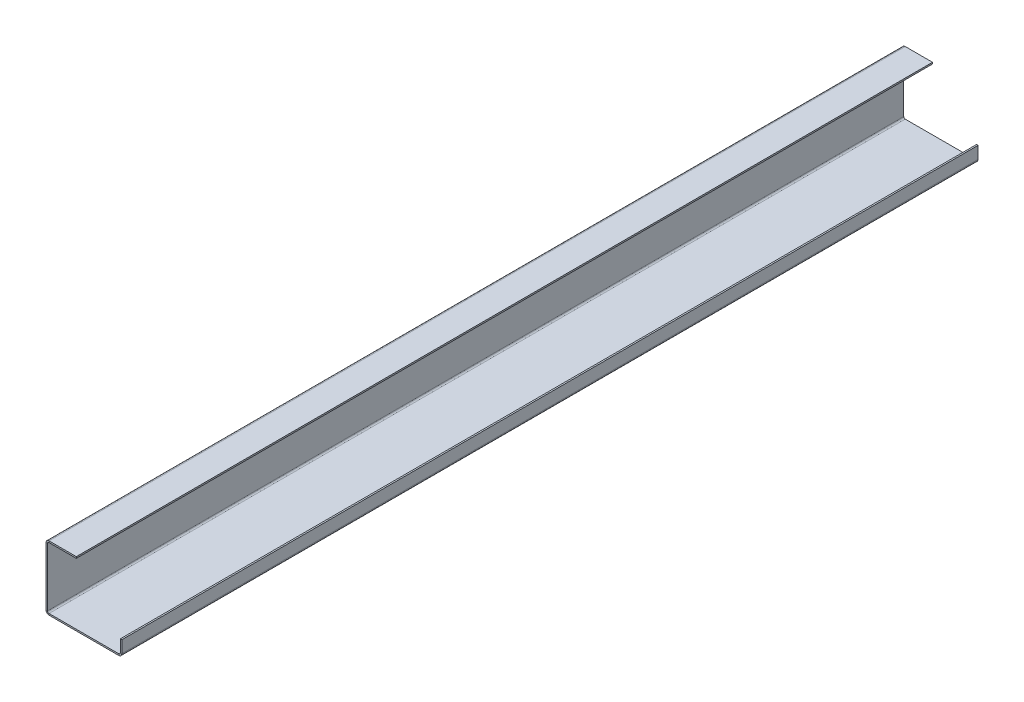
ISO-10303-21;
HEADER;
FILE_DESCRIPTION(('STEP AP214'),'2;1');
FILE_NAME('part.step','',(''),(''),'','','');
FILE_SCHEMA(('AUTOMOTIVE_DESIGN { 1 0 10303 214 1 1 1 1 }'));
ENDSEC;
DATA;
#1=APPLICATION_CONTEXT('core data for automotive mechanical design processes');
#2=APPLICATION_PROTOCOL_DEFINITION('international standard','automotive_design',2000,#1);
#3=PRODUCT_CONTEXT('',#1,'mechanical');
#4=PRODUCT('Part','Part','',(#3));
#5=PRODUCT_RELATED_PRODUCT_CATEGORY('part','',(#4));
#6=PRODUCT_DEFINITION_FORMATION('','',#4);
#7=PRODUCT_DEFINITION_CONTEXT('part definition',#1,'design');
#8=PRODUCT_DEFINITION('design','',#6,#7);
#9=PRODUCT_DEFINITION_SHAPE('','',#8);
#10=(LENGTH_UNIT() NAMED_UNIT(*) SI_UNIT(.MILLI.,.METRE.));
#11=(NAMED_UNIT(*) PLANE_ANGLE_UNIT() SI_UNIT($,.RADIAN.));
#12=(NAMED_UNIT(*) SI_UNIT($,.STERADIAN.) SOLID_ANGLE_UNIT());
#13=UNCERTAINTY_MEASURE_WITH_UNIT(LENGTH_MEASURE(1.E-05),#10,'distance_accuracy_value','');
#14=(GEOMETRIC_REPRESENTATION_CONTEXT(3) GLOBAL_UNCERTAINTY_ASSIGNED_CONTEXT((#13)) GLOBAL_UNIT_ASSIGNED_CONTEXT((#10,
#11,#12)) REPRESENTATION_CONTEXT('',''));
#15=CARTESIAN_POINT('',(0.,0.,0.));
#16=DIRECTION('',(0.,0.,1.));
#17=DIRECTION('',(1.,0.,0.));
#18=AXIS2_PLACEMENT_3D('',#15,#16,#17);
#19=CARTESIAN_POINT('',(4.,85.,1130.));
#20=DIRECTION('',(0.,0.,1.));
#21=DIRECTION('',(1.,0.,0.));
#22=AXIS2_PLACEMENT_3D('',#19,#20,#21);
#23=PLANE('',#22);
#24=DIRECTION('',(0.,-1.,0.));
#25=VECTOR('',#24,1.);
#26=CARTESIAN_POINT('',(4.,85.,1130.));
#27=LINE('',#26,#25);
#28=CARTESIAN_POINT('',(4.,85.,1130.));
#29=VERTEX_POINT('',#28);
#30=CARTESIAN_POINT('',(4.,83.,1130.));
#31=VERTEX_POINT('',#30);
#32=EDGE_CURVE('E11',#29,#31,#27,.T.);
#33=ORIENTED_EDGE('',*,*,#32,.F.);
#34=CARTESIAN_POINT('',(3.99999999999999,81.,1130.));
#35=DIRECTION('',(0.,0.,-1.));
#36=DIRECTION('',(-1.,0.,0.));
#37=AXIS2_PLACEMENT_3D('',#34,#35,#36);
#38=CIRCLE('',#37,4.);
#39=CARTESIAN_POINT('',(0.,81.,1130.));
#40=VERTEX_POINT('',#39);
#41=EDGE_CURVE('E303',#29,#40,#38,.F.);
#42=ORIENTED_EDGE('',*,*,#41,.T.);
#43=DIRECTION('',(-1.,0.,0.));
#44=VECTOR('',#43,1.);
#45=CARTESIAN_POINT('',(1.99999999999999,81.,1130.));
#46=LINE('',#45,#44);
#47=CARTESIAN_POINT('',(1.99999999999999,81.,1130.));
#48=VERTEX_POINT('',#47);
#49=EDGE_CURVE('E44',#48,#40,#46,.T.);
#50=ORIENTED_EDGE('',*,*,#49,.F.);
#51=CARTESIAN_POINT('',(3.99999999999999,81.,1130.));
#52=DIRECTION('',(0.,0.,1.));
#53=DIRECTION('',(1.,0.,0.));
#54=AXIS2_PLACEMENT_3D('',#51,#52,#53);
#55=CIRCLE('',#54,2.);
#56=EDGE_CURVE('E322',#31,#48,#55,.T.);
#57=ORIENTED_EDGE('',*,*,#56,.F.);
#58=EDGE_LOOP('',(#33,#42,#50,#57));
#59=FACE_BOUND('',#58,.T.);
#60=ADVANCED_FACE('F36',(#59),#23,.T.);
#61=CARTESIAN_POINT('',(1.99999999999999,81.,1130.));
#62=DIRECTION('',(0.,0.,1.));
#63=DIRECTION('',(1.,0.,0.));
#64=AXIS2_PLACEMENT_3D('',#61,#62,#63);
#65=PLANE('',#64);
#66=DIRECTION('',(-1.,0.,0.));
#67=VECTOR('',#66,1.);
#68=CARTESIAN_POINT('',(40.,85.,1130.));
#69=LINE('',#68,#67);
#70=CARTESIAN_POINT('',(40.,85.,1130.));
#71=VERTEX_POINT('',#70);
#72=EDGE_CURVE('E307',#71,#29,#69,.T.);
#73=ORIENTED_EDGE('',*,*,#72,.T.);
#74=ORIENTED_EDGE('',*,*,#32,.T.);
#75=DIRECTION('',(-1.,0.,0.));
#76=VECTOR('',#75,1.);
#77=CARTESIAN_POINT('',(40.,83.,1130.));
#78=LINE('',#77,#76);
#79=CARTESIAN_POINT('',(40.,83.,1130.));
#80=VERTEX_POINT('',#79);
#81=EDGE_CURVE('E319',#80,#31,#78,.T.);
#82=ORIENTED_EDGE('',*,*,#81,.F.);
#83=DIRECTION('',(0.,-1.,0.));
#84=VECTOR('',#83,1.);
#85=CARTESIAN_POINT('',(40.,85.,1130.));
#86=LINE('',#85,#84);
#87=EDGE_CURVE('E316',#71,#80,#86,.T.);
#88=ORIENTED_EDGE('',*,*,#87,.F.);
#89=EDGE_LOOP('',(#73,#74,#82,#88));
#90=FACE_BOUND('',#89,.T.);
#91=ADVANCED_FACE('F372',(#90),#65,.T.);
#92=CARTESIAN_POINT('',(0.,81.,0.));
#93=DIRECTION('',(0.,0.,-1.));
#94=DIRECTION('',(-1.,0.,0.));
#95=AXIS2_PLACEMENT_3D('',#92,#93,#94);
#96=PLANE('',#95);
#97=DIRECTION('',(1.,0.,0.));
#98=VECTOR('',#97,1.);
#99=CARTESIAN_POINT('',(0.,81.,0.));
#100=LINE('',#99,#98);
#101=CARTESIAN_POINT('',(0.,81.,0.));
#102=VERTEX_POINT('',#101);
#103=CARTESIAN_POINT('',(1.99999999999999,81.,0.));
#104=VERTEX_POINT('',#103);
#105=EDGE_CURVE('E289',#102,#104,#100,.T.);
#106=ORIENTED_EDGE('',*,*,#105,.F.);
#107=CARTESIAN_POINT('',(3.99999999999999,81.,0.));
#108=DIRECTION('',(0.,0.,-1.));
#109=DIRECTION('',(-1.,0.,0.));
#110=AXIS2_PLACEMENT_3D('',#107,#108,#109);
#111=CIRCLE('',#110,4.);
#112=CARTESIAN_POINT('',(4.,85.,0.));
#113=VERTEX_POINT('',#112);
#114=EDGE_CURVE('E231',#113,#102,#111,.F.);
#115=ORIENTED_EDGE('',*,*,#114,.F.);
#116=DIRECTION('',(0.,1.,0.));
#117=VECTOR('',#116,1.);
#118=CARTESIAN_POINT('',(4.,83.,0.));
#119=LINE('',#118,#117);
#120=CARTESIAN_POINT('',(4.,83.,0.));
#121=VERTEX_POINT('',#120);
#122=EDGE_CURVE('E287',#121,#113,#119,.T.);
#123=ORIENTED_EDGE('',*,*,#122,.F.);
#124=CARTESIAN_POINT('',(3.99999999999999,81.,0.));
#125=DIRECTION('',(0.,0.,1.));
#126=DIRECTION('',(1.,0.,0.));
#127=AXIS2_PLACEMENT_3D('',#124,#125,#126);
#128=CIRCLE('',#127,2.);
#129=EDGE_CURVE('E219',#121,#104,#128,.T.);
#130=ORIENTED_EDGE('',*,*,#129,.T.);
#131=EDGE_LOOP('',(#106,#115,#123,#130));
#132=FACE_BOUND('',#131,.T.);
#133=ADVANCED_FACE('F382',(#132),#96,.T.);
#134=CARTESIAN_POINT('',(4.,83.,0.));
#135=DIRECTION('',(0.,0.,-1.));
#136=DIRECTION('',(-1.,0.,0.));
#137=AXIS2_PLACEMENT_3D('',#134,#135,#136);
#138=PLANE('',#137);
#139=DIRECTION('',(0.,-1.,0.));
#140=VECTOR('',#139,1.);
#141=CARTESIAN_POINT('',(0.,85.,0.));
#142=LINE('',#141,#140);
#143=CARTESIAN_POINT('',(0.,4.,0.));
#144=VERTEX_POINT('',#143);
#145=EDGE_CURVE('E234',#102,#144,#142,.T.);
#146=ORIENTED_EDGE('',*,*,#145,.F.);
#147=ORIENTED_EDGE('',*,*,#105,.T.);
#148=DIRECTION('',(0.,-1.,0.));
#149=VECTOR('',#148,1.);
#150=CARTESIAN_POINT('',(1.99999999999999,85.,0.));
#151=LINE('',#150,#149);
#152=CARTESIAN_POINT('',(2.,4.,0.));
#153=VERTEX_POINT('',#152);
#154=EDGE_CURVE('E216',#104,#153,#151,.T.);
#155=ORIENTED_EDGE('',*,*,#154,.T.);
#156=DIRECTION('',(-1.,0.,0.));
#157=VECTOR('',#156,1.);
#158=CARTESIAN_POINT('',(2.,4.,0.));
#159=LINE('',#158,#157);
#160=EDGE_CURVE('E283',#153,#144,#159,.T.);
#161=ORIENTED_EDGE('',*,*,#160,.T.);
#162=EDGE_LOOP('',(#146,#147,#155,#161));
#163=FACE_BOUND('',#162,.T.);
#164=ADVANCED_FACE('F384',(#163),#138,.T.);
#165=CARTESIAN_POINT('',(0.,4.,1130.));
#166=DIRECTION('',(0.,0.,1.));
#167=DIRECTION('',(1.,0.,0.));
#168=AXIS2_PLACEMENT_3D('',#165,#166,#167);
#169=PLANE('',#168);
#170=DIRECTION('',(1.,0.,0.));
#171=VECTOR('',#170,1.);
#172=CARTESIAN_POINT('',(0.,4.,1130.));
#173=LINE('',#172,#171);
#174=CARTESIAN_POINT('',(0.,4.,1130.));
#175=VERTEX_POINT('',#174);
#176=CARTESIAN_POINT('',(2.,4.,1130.));
#177=VERTEX_POINT('',#176);
#178=EDGE_CURVE('E169',#175,#177,#173,.T.);
#179=ORIENTED_EDGE('',*,*,#178,.F.);
#180=CARTESIAN_POINT('',(4.,4.,1130.));
#181=DIRECTION('',(0.,0.,-1.));
#182=DIRECTION('',(-1.,0.,0.));
#183=AXIS2_PLACEMENT_3D('',#180,#181,#182);
#184=CIRCLE('',#183,4.);
#185=CARTESIAN_POINT('',(4.,0.,1130.));
#186=VERTEX_POINT('',#185);
#187=EDGE_CURVE('E173',#175,#186,#184,.F.);
#188=ORIENTED_EDGE('',*,*,#187,.T.);
#189=DIRECTION('',(0.,-1.,0.));
#190=VECTOR('',#189,1.);
#191=CARTESIAN_POINT('',(4.,2.,1130.));
#192=LINE('',#191,#190);
#193=CARTESIAN_POINT('',(4.,2.,1130.));
#194=VERTEX_POINT('',#193);
#195=EDGE_CURVE('E157',#194,#186,#192,.T.);
#196=ORIENTED_EDGE('',*,*,#195,.F.);
#197=CARTESIAN_POINT('',(4.,4.,1130.));
#198=DIRECTION('',(0.,0.,1.));
#199=DIRECTION('',(1.,0.,0.));
#200=AXIS2_PLACEMENT_3D('',#197,#198,#199);
#201=CIRCLE('',#200,2.);
#202=EDGE_CURVE('E325',#177,#194,#201,.T.);
#203=ORIENTED_EDGE('',*,*,#202,.F.);
#204=EDGE_LOOP('',(#179,#188,#196,#203));
#205=FACE_BOUND('',#204,.T.);
#206=ADVANCED_FACE('F175',(#205),#169,.T.);
#207=CARTESIAN_POINT('',(4.,2.,1130.));
#208=DIRECTION('',(0.,0.,1.));
#209=DIRECTION('',(1.,0.,0.));
#210=AXIS2_PLACEMENT_3D('',#207,#208,#209);
#211=PLANE('',#210);
#212=DIRECTION('',(0.,-1.,0.));
#213=VECTOR('',#212,1.);
#214=CARTESIAN_POINT('',(0.,85.,1130.));
#215=LINE('',#214,#213);
#216=EDGE_CURVE('E179',#40,#175,#215,.T.);
#217=ORIENTED_EDGE('',*,*,#216,.T.);
#218=ORIENTED_EDGE('',*,*,#178,.T.);
#219=DIRECTION('',(0.,-1.,0.));
#220=VECTOR('',#219,1.);
#221=CARTESIAN_POINT('',(1.99999999999999,85.,1130.));
#222=LINE('',#221,#220);
#223=EDGE_CURVE('E297',#48,#177,#222,.T.);
#224=ORIENTED_EDGE('',*,*,#223,.F.);
#225=ORIENTED_EDGE('',*,*,#49,.T.);
#226=EDGE_LOOP('',(#217,#218,#224,#225));
#227=FACE_BOUND('',#226,.T.);
#228=ADVANCED_FACE('F293',(#227),#211,.T.);
#229=CARTESIAN_POINT('',(4.,0.,0.));
#230=DIRECTION('',(0.,0.,-1.));
#231=DIRECTION('',(-1.,0.,0.));
#232=AXIS2_PLACEMENT_3D('',#229,#230,#231);
#233=PLANE('',#232);
#234=DIRECTION('',(0.,1.,0.));
#235=VECTOR('',#234,1.);
#236=CARTESIAN_POINT('',(4.,0.,0.));
#237=LINE('',#236,#235);
#238=CARTESIAN_POINT('',(4.,0.,0.));
#239=VERTEX_POINT('',#238);
#240=CARTESIAN_POINT('',(4.,2.,0.));
#241=VERTEX_POINT('',#240);
#242=EDGE_CURVE('E170',#239,#241,#237,.T.);
#243=ORIENTED_EDGE('',*,*,#242,.F.);
#244=CARTESIAN_POINT('',(4.,4.,0.));
#245=DIRECTION('',(0.,0.,-1.));
#246=DIRECTION('',(-1.,0.,0.));
#247=AXIS2_PLACEMENT_3D('',#244,#245,#246);
#248=CIRCLE('',#247,4.);
#249=EDGE_CURVE('E186',#144,#239,#248,.F.);
#250=ORIENTED_EDGE('',*,*,#249,.F.);
#251=ORIENTED_EDGE('',*,*,#160,.F.);
#252=CARTESIAN_POINT('',(4.,4.,0.));
#253=DIRECTION('',(0.,0.,1.));
#254=DIRECTION('',(1.,0.,0.));
#255=AXIS2_PLACEMENT_3D('',#252,#253,#254);
#256=CIRCLE('',#255,2.);
#257=EDGE_CURVE('E213',#153,#241,#256,.T.);
#258=ORIENTED_EDGE('',*,*,#257,.T.);
#259=EDGE_LOOP('',(#243,#250,#251,#258));
#260=FACE_BOUND('',#259,.T.);
#261=ADVANCED_FACE('F386',(#260),#233,.T.);
#262=CARTESIAN_POINT('',(2.,4.,0.));
#263=DIRECTION('',(0.,0.,-1.));
#264=DIRECTION('',(-1.,0.,0.));
#265=AXIS2_PLACEMENT_3D('',#262,#263,#264);
#266=PLANE('',#265);
#267=DIRECTION('',(1.,0.,0.));
#268=VECTOR('',#267,1.);
#269=CARTESIAN_POINT('',(0.,0.,0.));
#270=LINE('',#269,#268);
#271=CARTESIAN_POINT('',(96.,0.,0.));
#272=VERTEX_POINT('',#271);
#273=EDGE_CURVE('E238',#239,#272,#270,.T.);
#274=ORIENTED_EDGE('',*,*,#273,.F.);
#275=ORIENTED_EDGE('',*,*,#242,.T.);
#276=DIRECTION('',(1.,0.,0.));
#277=VECTOR('',#276,1.);
#278=CARTESIAN_POINT('',(0.,2.,0.));
#279=LINE('',#278,#277);
#280=CARTESIAN_POINT('',(96.,2.,0.));
#281=VERTEX_POINT('',#280);
#282=EDGE_CURVE('E211',#241,#281,#279,.T.);
#283=ORIENTED_EDGE('',*,*,#282,.T.);
#284=DIRECTION('',(0.,-1.,0.));
#285=VECTOR('',#284,1.);
#286=CARTESIAN_POINT('',(96.,2.,0.));
#287=LINE('',#286,#285);
#288=EDGE_CURVE('E105',#281,#272,#287,.T.);
#289=ORIENTED_EDGE('',*,*,#288,.T.);
#290=EDGE_LOOP('',(#274,#275,#283,#289));
#291=FACE_BOUND('',#290,.T.);
#292=ADVANCED_FACE('F387',(#291),#266,.T.);
#293=CARTESIAN_POINT('',(96.,0.,1130.));
#294=DIRECTION('',(0.,0.,1.));
#295=DIRECTION('',(1.,0.,0.));
#296=AXIS2_PLACEMENT_3D('',#293,#294,#295);
#297=PLANE('',#296);
#298=DIRECTION('',(0.,1.,0.));
#299=VECTOR('',#298,1.);
#300=CARTESIAN_POINT('',(96.,0.,1130.));
#301=LINE('',#300,#299);
#302=CARTESIAN_POINT('',(96.,0.,1130.));
#303=VERTEX_POINT('',#302);
#304=CARTESIAN_POINT('',(96.,2.,1130.));
#305=VERTEX_POINT('',#304);
#306=EDGE_CURVE('E281',#303,#305,#301,.T.);
#307=ORIENTED_EDGE('',*,*,#306,.F.);
#308=CARTESIAN_POINT('',(96.,4.,1130.));
#309=DIRECTION('',(0.,0.,-1.));
#310=DIRECTION('',(-1.,0.,0.));
#311=AXIS2_PLACEMENT_3D('',#308,#309,#310);
#312=CIRCLE('',#311,4.);
#313=CARTESIAN_POINT('',(100.,4.,1130.));
#314=VERTEX_POINT('',#313);
#315=EDGE_CURVE('E194',#303,#314,#312,.F.);
#316=ORIENTED_EDGE('',*,*,#315,.T.);
#317=DIRECTION('',(1.,0.,0.));
#318=VECTOR('',#317,1.);
#319=CARTESIAN_POINT('',(98.,4.,1130.));
#320=LINE('',#319,#318);
#321=CARTESIAN_POINT('',(98.,4.,1130.));
#322=VERTEX_POINT('',#321);
#323=EDGE_CURVE('E52',#322,#314,#320,.T.);
#324=ORIENTED_EDGE('',*,*,#323,.F.);
#325=CARTESIAN_POINT('',(96.,4.,1130.));
#326=DIRECTION('',(0.,0.,1.));
#327=DIRECTION('',(1.,0.,0.));
#328=AXIS2_PLACEMENT_3D('',#325,#326,#327);
#329=CIRCLE('',#328,2.);
#330=EDGE_CURVE('E328',#305,#322,#329,.T.);
#331=ORIENTED_EDGE('',*,*,#330,.F.);
#332=EDGE_LOOP('',(#307,#316,#324,#331));
#333=FACE_BOUND('',#332,.T.);
#334=ADVANCED_FACE('F351',(#333),#297,.T.);
#335=CARTESIAN_POINT('',(98.,4.,1130.));
#336=DIRECTION('',(0.,0.,1.));
#337=DIRECTION('',(1.,0.,0.));
#338=AXIS2_PLACEMENT_3D('',#335,#336,#337);
#339=PLANE('',#338);
#340=DIRECTION('',(1.,0.,0.));
#341=VECTOR('',#340,1.);
#342=CARTESIAN_POINT('',(0.,0.,1130.));
#343=LINE('',#342,#341);
#344=EDGE_CURVE('E161',#186,#303,#343,.T.);
#345=ORIENTED_EDGE('',*,*,#344,.T.);
#346=ORIENTED_EDGE('',*,*,#306,.T.);
#347=DIRECTION('',(1.,0.,0.));
#348=VECTOR('',#347,1.);
#349=CARTESIAN_POINT('',(0.,2.,1130.));
#350=LINE('',#349,#348);
#351=EDGE_CURVE('E164',#194,#305,#350,.T.);
#352=ORIENTED_EDGE('',*,*,#351,.F.);
#353=ORIENTED_EDGE('',*,*,#195,.T.);
#354=EDGE_LOOP('',(#345,#346,#352,#353));
#355=FACE_BOUND('',#354,.T.);
#356=ADVANCED_FACE('F159',(#355),#339,.T.);
#357=CARTESIAN_POINT('',(100.,4.,0.));
#358=DIRECTION('',(0.,0.,-1.));
#359=DIRECTION('',(-1.,0.,0.));
#360=AXIS2_PLACEMENT_3D('',#357,#358,#359);
#361=PLANE('',#360);
#362=DIRECTION('',(-1.,0.,0.));
#363=VECTOR('',#362,1.);
#364=CARTESIAN_POINT('',(100.,4.,0.));
#365=LINE('',#364,#363);
#366=CARTESIAN_POINT('',(100.,4.,0.));
#367=VERTEX_POINT('',#366);
#368=CARTESIAN_POINT('',(98.,4.,0.));
#369=VERTEX_POINT('',#368);
#370=EDGE_CURVE('E112',#367,#369,#365,.T.);
#371=ORIENTED_EDGE('',*,*,#370,.F.);
#372=CARTESIAN_POINT('',(96.,4.,0.));
#373=DIRECTION('',(0.,0.,-1.));
#374=DIRECTION('',(-1.,0.,0.));
#375=AXIS2_PLACEMENT_3D('',#372,#373,#374);
#376=CIRCLE('',#375,4.);
#377=EDGE_CURVE('E240',#272,#367,#376,.F.);
#378=ORIENTED_EDGE('',*,*,#377,.F.);
#379=ORIENTED_EDGE('',*,*,#288,.F.);
#380=CARTESIAN_POINT('',(96.,4.,0.));
#381=DIRECTION('',(0.,0.,1.));
#382=DIRECTION('',(1.,0.,0.));
#383=AXIS2_PLACEMENT_3D('',#380,#381,#382);
#384=CIRCLE('',#383,2.);
#385=EDGE_CURVE('E209',#281,#369,#384,.T.);
#386=ORIENTED_EDGE('',*,*,#385,.T.);
#387=EDGE_LOOP('',(#371,#378,#379,#386));
#388=FACE_BOUND('',#387,.T.);
#389=ADVANCED_FACE('F391',(#388),#361,.T.);
#390=CARTESIAN_POINT('',(96.,2.,0.));
#391=DIRECTION('',(0.,0.,-1.));
#392=DIRECTION('',(-1.,0.,0.));
#393=AXIS2_PLACEMENT_3D('',#390,#391,#392);
#394=PLANE('',#393);
#395=DIRECTION('',(0.,1.,0.));
#396=VECTOR('',#395,1.);
#397=CARTESIAN_POINT('',(100.,0.,0.));
#398=LINE('',#397,#396);
#399=CARTESIAN_POINT('',(100.,20.,0.));
#400=VERTEX_POINT('',#399);
#401=EDGE_CURVE('E200',#367,#400,#398,.T.);
#402=ORIENTED_EDGE('',*,*,#401,.F.);
#403=ORIENTED_EDGE('',*,*,#370,.T.);
#404=DIRECTION('',(0.,1.,0.));
#405=VECTOR('',#404,1.);
#406=CARTESIAN_POINT('',(98.,0.,0.));
#407=LINE('',#406,#405);
#408=CARTESIAN_POINT('',(98.,20.,0.));
#409=VERTEX_POINT('',#408);
#410=EDGE_CURVE('E206',#369,#409,#407,.T.);
#411=ORIENTED_EDGE('',*,*,#410,.T.);
#412=DIRECTION('',(1.,0.,0.));
#413=VECTOR('',#412,1.);
#414=CARTESIAN_POINT('',(98.,20.,0.));
#415=LINE('',#414,#413);
#416=EDGE_CURVE('E203',#409,#400,#415,.T.);
#417=ORIENTED_EDGE('',*,*,#416,.T.);
#418=EDGE_LOOP('',(#402,#403,#411,#417));
#419=FACE_BOUND('',#418,.T.);
#420=ADVANCED_FACE('F393',(#419),#394,.T.);
#421=CARTESIAN_POINT('',(100.,0.,1130.));
#422=DIRECTION('',(-1.,0.,0.));
#423=DIRECTION('',(0.,0.,1.));
#424=AXIS2_PLACEMENT_3D('',#421,#422,#423);
#425=PLANE('',#424);
#426=ORIENTED_EDGE('',*,*,#401,.T.);
#427=DIRECTION('',(0.,0.,-1.));
#428=VECTOR('',#427,1.);
#429=CARTESIAN_POINT('',(100.,20.,1130.));
#430=LINE('',#429,#428);
#431=CARTESIAN_POINT('',(100.,20.,1130.));
#432=VERTEX_POINT('',#431);
#433=EDGE_CURVE('E276',#432,#400,#430,.T.);
#434=ORIENTED_EDGE('',*,*,#433,.F.);
#435=DIRECTION('',(0.,1.,0.));
#436=VECTOR('',#435,1.);
#437=CARTESIAN_POINT('',(100.,0.,1130.));
#438=LINE('',#437,#436);
#439=EDGE_CURVE('E118',#314,#432,#438,.T.);
#440=ORIENTED_EDGE('',*,*,#439,.F.);
#441=DIRECTION('',(0.,0.,-1.));
#442=VECTOR('',#441,1.);
#443=CARTESIAN_POINT('',(100.,4.,1130.));
#444=LINE('',#443,#442);
#445=EDGE_CURVE('E196',#314,#367,#444,.T.);
#446=ORIENTED_EDGE('',*,*,#445,.T.);
#447=EDGE_LOOP('',(#426,#434,#440,#446));
#448=FACE_BOUND('',#447,.T.);
#449=ADVANCED_FACE('F399',(#448),#425,.F.);
#450=CARTESIAN_POINT('',(98.,20.,1130.));
#451=DIRECTION('',(0.,1.,0.));
#452=DIRECTION('',(0.,0.,1.));
#453=AXIS2_PLACEMENT_3D('',#450,#451,#452);
#454=PLANE('',#453);
#455=ORIENTED_EDGE('',*,*,#416,.F.);
#456=DIRECTION('',(0.,0.,-1.));
#457=VECTOR('',#456,1.);
#458=CARTESIAN_POINT('',(98.,20.,1130.));
#459=LINE('',#458,#457);
#460=CARTESIAN_POINT('',(98.,20.,1130.));
#461=VERTEX_POINT('',#460);
#462=EDGE_CURVE('E274',#461,#409,#459,.T.);
#463=ORIENTED_EDGE('',*,*,#462,.F.);
#464=DIRECTION('',(1.,0.,0.));
#465=VECTOR('',#464,1.);
#466=CARTESIAN_POINT('',(98.,20.,1130.));
#467=LINE('',#466,#465);
#468=EDGE_CURVE('E334',#461,#432,#467,.T.);
#469=ORIENTED_EDGE('',*,*,#468,.T.);
#470=ORIENTED_EDGE('',*,*,#433,.T.);
#471=EDGE_LOOP('',(#455,#463,#469,#470));
#472=FACE_BOUND('',#471,.T.);
#473=ADVANCED_FACE('F339',(#472),#454,.T.);
#474=CARTESIAN_POINT('',(98.,0.,1130.));
#475=DIRECTION('',(-1.,0.,0.));
#476=DIRECTION('',(0.,0.,1.));
#477=AXIS2_PLACEMENT_3D('',#474,#475,#476);
#478=PLANE('',#477);
#479=ORIENTED_EDGE('',*,*,#410,.F.);
#480=DIRECTION('',(0.,0.,-1.));
#481=VECTOR('',#480,1.);
#482=CARTESIAN_POINT('',(98.,4.,1130.));
#483=LINE('',#482,#481);
#484=EDGE_CURVE('E271',#322,#369,#483,.T.);
#485=ORIENTED_EDGE('',*,*,#484,.F.);
#486=DIRECTION('',(0.,1.,0.));
#487=VECTOR('',#486,1.);
#488=CARTESIAN_POINT('',(98.,0.,1130.));
#489=LINE('',#488,#487);
#490=EDGE_CURVE('E331',#322,#461,#489,.T.);
#491=ORIENTED_EDGE('',*,*,#490,.T.);
#492=ORIENTED_EDGE('',*,*,#462,.T.);
#493=EDGE_LOOP('',(#479,#485,#491,#492));
#494=FACE_BOUND('',#493,.T.);
#495=ADVANCED_FACE('F344',(#494),#478,.T.);
#496=CARTESIAN_POINT('',(96.,4.,1130.));
#497=DIRECTION('',(0.,0.,-1.));
#498=DIRECTION('',(-1.,0.,0.));
#499=AXIS2_PLACEMENT_3D('',#496,#497,#498);
#500=CYLINDRICAL_SURFACE('',#499,2.);
#501=ORIENTED_EDGE('',*,*,#385,.F.);
#502=DIRECTION('',(0.,0.,-1.));
#503=VECTOR('',#502,1.);
#504=CARTESIAN_POINT('',(96.,2.,1130.));
#505=LINE('',#504,#503);
#506=EDGE_CURVE('E268',#305,#281,#505,.T.);
#507=ORIENTED_EDGE('',*,*,#506,.F.);
#508=ORIENTED_EDGE('',*,*,#330,.T.);
#509=ORIENTED_EDGE('',*,*,#484,.T.);
#510=EDGE_LOOP('',(#501,#507,#508,#509));
#511=FACE_BOUND('',#510,.T.);
#512=ADVANCED_FACE('F347',(#511),#500,.F.);
#513=CARTESIAN_POINT('',(0.,2.,1130.));
#514=DIRECTION('',(0.,1.,0.));
#515=DIRECTION('',(0.,0.,1.));
#516=AXIS2_PLACEMENT_3D('',#513,#514,#515);
#517=PLANE('',#516);
#518=ORIENTED_EDGE('',*,*,#282,.F.);
#519=DIRECTION('',(0.,0.,-1.));
#520=VECTOR('',#519,1.);
#521=CARTESIAN_POINT('',(4.,2.,1130.));
#522=LINE('',#521,#520);
#523=EDGE_CURVE('E265',#194,#241,#522,.T.);
#524=ORIENTED_EDGE('',*,*,#523,.F.);
#525=ORIENTED_EDGE('',*,*,#351,.T.);
#526=ORIENTED_EDGE('',*,*,#506,.T.);
#527=EDGE_LOOP('',(#518,#524,#525,#526));
#528=FACE_BOUND('',#527,.T.);
#529=ADVANCED_FACE('F354',(#528),#517,.T.);
#530=CARTESIAN_POINT('',(4.,4.,1130.));
#531=DIRECTION('',(0.,0.,-1.));
#532=DIRECTION('',(-1.,0.,0.));
#533=AXIS2_PLACEMENT_3D('',#530,#531,#532);
#534=CYLINDRICAL_SURFACE('',#533,2.);
#535=ORIENTED_EDGE('',*,*,#257,.F.);
#536=DIRECTION('',(0.,0.,-1.));
#537=VECTOR('',#536,1.);
#538=CARTESIAN_POINT('',(2.,4.,1130.));
#539=LINE('',#538,#537);
#540=EDGE_CURVE('E262',#177,#153,#539,.T.);
#541=ORIENTED_EDGE('',*,*,#540,.F.);
#542=ORIENTED_EDGE('',*,*,#202,.T.);
#543=ORIENTED_EDGE('',*,*,#523,.T.);
#544=EDGE_LOOP('',(#535,#541,#542,#543));
#545=FACE_BOUND('',#544,.T.);
#546=ADVANCED_FACE('F357',(#545),#534,.F.);
#547=CARTESIAN_POINT('',(1.99999999999999,85.,1130.));
#548=DIRECTION('',(1.,0.,0.));
#549=DIRECTION('',(0.,1.,0.));
#550=AXIS2_PLACEMENT_3D('',#547,#548,#549);
#551=PLANE('',#550);
#552=ORIENTED_EDGE('',*,*,#154,.F.);
#553=DIRECTION('',(0.,0.,-1.));
#554=VECTOR('',#553,1.);
#555=CARTESIAN_POINT('',(1.99999999999999,81.,1130.));
#556=LINE('',#555,#554);
#557=EDGE_CURVE('E259',#48,#104,#556,.T.);
#558=ORIENTED_EDGE('',*,*,#557,.F.);
#559=ORIENTED_EDGE('',*,*,#223,.T.);
#560=ORIENTED_EDGE('',*,*,#540,.T.);
#561=EDGE_LOOP('',(#552,#558,#559,#560));
#562=FACE_BOUND('',#561,.T.);
#563=ADVANCED_FACE('F361',(#562),#551,.T.);
#564=CARTESIAN_POINT('',(3.99999999999999,81.,1130.));
#565=DIRECTION('',(0.,0.,-1.));
#566=DIRECTION('',(-1.,0.,0.));
#567=AXIS2_PLACEMENT_3D('',#564,#565,#566);
#568=CYLINDRICAL_SURFACE('',#567,2.);
#569=ORIENTED_EDGE('',*,*,#129,.F.);
#570=DIRECTION('',(0.,0.,-1.));
#571=VECTOR('',#570,1.);
#572=CARTESIAN_POINT('',(4.,83.,1130.));
#573=LINE('',#572,#571);
#574=EDGE_CURVE('E256',#31,#121,#573,.T.);
#575=ORIENTED_EDGE('',*,*,#574,.F.);
#576=ORIENTED_EDGE('',*,*,#56,.T.);
#577=ORIENTED_EDGE('',*,*,#557,.T.);
#578=EDGE_LOOP('',(#569,#575,#576,#577));
#579=FACE_BOUND('',#578,.T.);
#580=ADVANCED_FACE('F364',(#579),#568,.F.);
#581=CARTESIAN_POINT('',(40.,83.,1130.));
#582=DIRECTION('',(0.,-1.,0.));
#583=DIRECTION('',(1.,0.,0.));
#584=AXIS2_PLACEMENT_3D('',#581,#582,#583);
#585=PLANE('',#584);
#586=DIRECTION('',(-1.,0.,0.));
#587=VECTOR('',#586,1.);
#588=CARTESIAN_POINT('',(40.,83.,0.));
#589=LINE('',#588,#587);
#590=CARTESIAN_POINT('',(40.,83.,0.));
#591=VERTEX_POINT('',#590);
#592=EDGE_CURVE('E222',#591,#121,#589,.T.);
#593=ORIENTED_EDGE('',*,*,#592,.F.);
#594=DIRECTION('',(0.,0.,-1.));
#595=VECTOR('',#594,1.);
#596=CARTESIAN_POINT('',(40.,83.,1130.));
#597=LINE('',#596,#595);
#598=EDGE_CURVE('E254',#80,#591,#597,.T.);
#599=ORIENTED_EDGE('',*,*,#598,.F.);
#600=ORIENTED_EDGE('',*,*,#81,.T.);
#601=ORIENTED_EDGE('',*,*,#574,.T.);
#602=EDGE_LOOP('',(#593,#599,#600,#601));
#603=FACE_BOUND('',#602,.T.);
#604=ADVANCED_FACE('F369',(#603),#585,.T.);
#605=CARTESIAN_POINT('',(40.,85.,1130.));
#606=DIRECTION('',(1.,0.,0.));
#607=DIRECTION('',(0.,0.,-1.));
#608=AXIS2_PLACEMENT_3D('',#605,#606,#607);
#609=PLANE('',#608);
#610=DIRECTION('',(0.,-1.,0.));
#611=VECTOR('',#610,1.);
#612=CARTESIAN_POINT('',(40.,85.,0.));
#613=LINE('',#612,#611);
#614=CARTESIAN_POINT('',(40.,85.,0.));
#615=VERTEX_POINT('',#614);
#616=EDGE_CURVE('E225',#615,#591,#613,.T.);
#617=ORIENTED_EDGE('',*,*,#616,.F.);
#618=DIRECTION('',(0.,0.,-1.));
#619=VECTOR('',#618,1.);
#620=CARTESIAN_POINT('',(40.,85.,1130.));
#621=LINE('',#620,#619);
#622=EDGE_CURVE('E252',#71,#615,#621,.T.);
#623=ORIENTED_EDGE('',*,*,#622,.F.);
#624=ORIENTED_EDGE('',*,*,#87,.T.);
#625=ORIENTED_EDGE('',*,*,#598,.T.);
#626=EDGE_LOOP('',(#617,#623,#624,#625));
#627=FACE_BOUND('',#626,.T.);
#628=ADVANCED_FACE('F375',(#627),#609,.T.);
#629=CARTESIAN_POINT('',(40.,85.,1130.));
#630=DIRECTION('',(0.,-1.,0.));
#631=DIRECTION('',(1.,0.,0.));
#632=AXIS2_PLACEMENT_3D('',#629,#630,#631);
#633=PLANE('',#632);
#634=DIRECTION('',(-1.,0.,0.));
#635=VECTOR('',#634,1.);
#636=CARTESIAN_POINT('',(40.,85.,0.));
#637=LINE('',#636,#635);
#638=EDGE_CURVE('E228',#615,#113,#637,.T.);
#639=ORIENTED_EDGE('',*,*,#638,.T.);
#640=DIRECTION('',(0.,0.,-1.));
#641=VECTOR('',#640,1.);
#642=CARTESIAN_POINT('',(4.,85.,1130.));
#643=LINE('',#642,#641);
#644=EDGE_CURVE('E249',#29,#113,#643,.T.);
#645=ORIENTED_EDGE('',*,*,#644,.F.);
#646=ORIENTED_EDGE('',*,*,#72,.F.);
#647=ORIENTED_EDGE('',*,*,#622,.T.);
#648=EDGE_LOOP('',(#639,#645,#646,#647));
#649=FACE_BOUND('',#648,.T.);
#650=ADVANCED_FACE('F380',(#649),#633,.F.);
#651=CARTESIAN_POINT('',(3.99999999999999,81.,1130.));
#652=DIRECTION('',(0.,0.,-1.));
#653=DIRECTION('',(-1.,0.,0.));
#654=AXIS2_PLACEMENT_3D('',#651,#652,#653);
#655=CYLINDRICAL_SURFACE('',#654,4.);
#656=ORIENTED_EDGE('',*,*,#114,.T.);
#657=DIRECTION('',(0.,0.,-1.));
#658=VECTOR('',#657,1.);
#659=CARTESIAN_POINT('',(0.,81.,1130.));
#660=LINE('',#659,#658);
#661=EDGE_CURVE('E246',#40,#102,#660,.T.);
#662=ORIENTED_EDGE('',*,*,#661,.F.);
#663=ORIENTED_EDGE('',*,*,#41,.F.);
#664=ORIENTED_EDGE('',*,*,#644,.T.);
#665=EDGE_LOOP('',(#656,#662,#663,#664));
#666=FACE_BOUND('',#665,.T.);
#667=ADVANCED_FACE('F309',(#666),#655,.T.);
#668=CARTESIAN_POINT('',(0.,85.,1130.));
#669=DIRECTION('',(1.,0.,0.));
#670=DIRECTION('',(0.,1.,0.));
#671=AXIS2_PLACEMENT_3D('',#668,#669,#670);
#672=PLANE('',#671);
#673=ORIENTED_EDGE('',*,*,#145,.T.);
#674=DIRECTION('',(0.,0.,-1.));
#675=VECTOR('',#674,1.);
#676=CARTESIAN_POINT('',(0.,4.,1130.));
#677=LINE('',#676,#675);
#678=EDGE_CURVE('E188',#175,#144,#677,.T.);
#679=ORIENTED_EDGE('',*,*,#678,.F.);
#680=ORIENTED_EDGE('',*,*,#216,.F.);
#681=ORIENTED_EDGE('',*,*,#661,.T.);
#682=EDGE_LOOP('',(#673,#679,#680,#681));
#683=FACE_BOUND('',#682,.T.);
#684=ADVANCED_FACE('F313',(#683),#672,.F.);
#685=CARTESIAN_POINT('',(4.,4.,1130.));
#686=DIRECTION('',(0.,0.,-1.));
#687=DIRECTION('',(-1.,0.,0.));
#688=AXIS2_PLACEMENT_3D('',#685,#686,#687);
#689=CYLINDRICAL_SURFACE('',#688,4.);
#690=ORIENTED_EDGE('',*,*,#249,.T.);
#691=DIRECTION('',(0.,0.,-1.));
#692=VECTOR('',#691,1.);
#693=CARTESIAN_POINT('',(4.,0.,1130.));
#694=LINE('',#693,#692);
#695=EDGE_CURVE('E183',#186,#239,#694,.T.);
#696=ORIENTED_EDGE('',*,*,#695,.F.);
#697=ORIENTED_EDGE('',*,*,#187,.F.);
#698=ORIENTED_EDGE('',*,*,#678,.T.);
#699=EDGE_LOOP('',(#690,#696,#697,#698));
#700=FACE_BOUND('',#699,.T.);
#701=ADVANCED_FACE('F184',(#700),#689,.T.);
#702=CARTESIAN_POINT('',(0.,0.,1130.));
#703=DIRECTION('',(0.,1.,0.));
#704=DIRECTION('',(0.,0.,1.));
#705=AXIS2_PLACEMENT_3D('',#702,#703,#704);
#706=PLANE('',#705);
#707=ORIENTED_EDGE('',*,*,#273,.T.);
#708=DIRECTION('',(0.,0.,-1.));
#709=VECTOR('',#708,1.);
#710=CARTESIAN_POINT('',(96.,0.,1130.));
#711=LINE('',#710,#709);
#712=EDGE_CURVE('E189',#303,#272,#711,.T.);
#713=ORIENTED_EDGE('',*,*,#712,.F.);
#714=ORIENTED_EDGE('',*,*,#344,.F.);
#715=ORIENTED_EDGE('',*,*,#695,.T.);
#716=EDGE_LOOP('',(#707,#713,#714,#715));
#717=FACE_BOUND('',#716,.T.);
#718=ADVANCED_FACE('F191',(#717),#706,.F.);
#719=CARTESIAN_POINT('',(96.,4.,1130.));
#720=DIRECTION('',(0.,0.,-1.));
#721=DIRECTION('',(-1.,0.,0.));
#722=AXIS2_PLACEMENT_3D('',#719,#720,#721);
#723=CYLINDRICAL_SURFACE('',#722,4.);
#724=ORIENTED_EDGE('',*,*,#377,.T.);
#725=ORIENTED_EDGE('',*,*,#445,.F.);
#726=ORIENTED_EDGE('',*,*,#315,.F.);
#727=ORIENTED_EDGE('',*,*,#712,.T.);
#728=EDGE_LOOP('',(#724,#725,#726,#727));
#729=FACE_BOUND('',#728,.T.);
#730=ADVANCED_FACE('F389',(#729),#723,.T.);
#731=CARTESIAN_POINT('',(96.,4.,1130.));
#732=DIRECTION('',(0.,0.,1.));
#733=DIRECTION('',(1.,0.,0.));
#734=AXIS2_PLACEMENT_3D('',#731,#732,#733);
#735=PLANE('',#734);
#736=ORIENTED_EDGE('',*,*,#439,.T.);
#737=ORIENTED_EDGE('',*,*,#468,.F.);
#738=ORIENTED_EDGE('',*,*,#490,.F.);
#739=ORIENTED_EDGE('',*,*,#323,.T.);
#740=EDGE_LOOP('',(#736,#737,#738,#739));
#741=FACE_BOUND('',#740,.T.);
#742=ADVANCED_FACE('F340',(#741),#735,.T.);
#743=CARTESIAN_POINT('',(96.,4.,0.));
#744=DIRECTION('',(0.,0.,1.));
#745=DIRECTION('',(1.,0.,0.));
#746=AXIS2_PLACEMENT_3D('',#743,#744,#745);
#747=PLANE('',#746);
#748=ORIENTED_EDGE('',*,*,#592,.T.);
#749=ORIENTED_EDGE('',*,*,#122,.T.);
#750=ORIENTED_EDGE('',*,*,#638,.F.);
#751=ORIENTED_EDGE('',*,*,#616,.T.);
#752=EDGE_LOOP('',(#748,#749,#750,#751));
#753=FACE_BOUND('',#752,.T.);
#754=ADVANCED_FACE('F598',(#753),#747,.F.);
#755=CLOSED_SHELL('',(#60,#91,#133,#164,#206,#228,#261,#292,#334,#356,#389,#420,#449,#473,#495,
#512,#529,#546,#563,#580,#604,#628,#650,#667,#684,#701,#718,#730,#742,#754));
#756=MANIFOLD_SOLID_BREP('B2',#755);
#757=ADVANCED_BREP_SHAPE_REPRESENTATION('',(#18,#756),#14);
#758=SHAPE_DEFINITION_REPRESENTATION(#9,#757);
ENDSEC;
END-ISO-10303-21;
